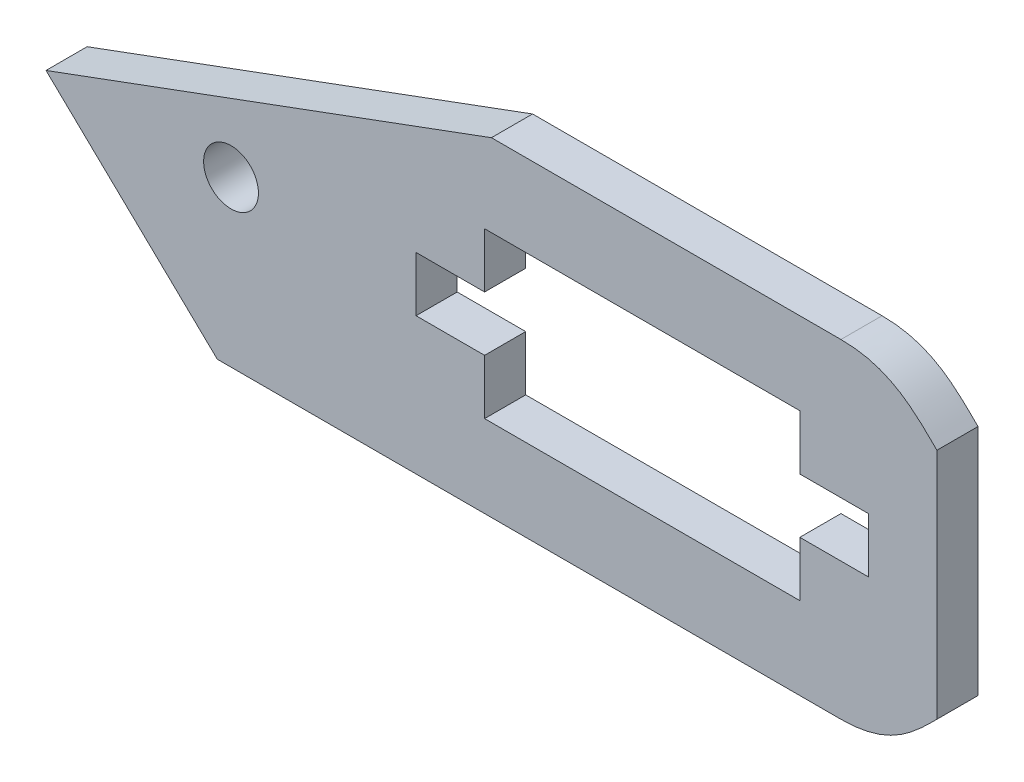
ISO-10303-21;
HEADER;
FILE_DESCRIPTION(('STEP AP214'),'2;1');
FILE_NAME('part.step','',(''),(''),'','','');
FILE_SCHEMA(('AUTOMOTIVE_DESIGN { 1 0 10303 214 1 1 1 1 }'));
ENDSEC;
DATA;
#1=APPLICATION_CONTEXT('core data for automotive mechanical design processes');
#2=APPLICATION_PROTOCOL_DEFINITION('international standard','automotive_design',2000,#1);
#3=PRODUCT_CONTEXT('',#1,'mechanical');
#4=PRODUCT('Part','Part','',(#3));
#5=PRODUCT_RELATED_PRODUCT_CATEGORY('part','',(#4));
#6=PRODUCT_DEFINITION_FORMATION('','',#4);
#7=PRODUCT_DEFINITION_CONTEXT('part definition',#1,'design');
#8=PRODUCT_DEFINITION('design','',#6,#7);
#9=PRODUCT_DEFINITION_SHAPE('','',#8);
#10=(LENGTH_UNIT() NAMED_UNIT(*) SI_UNIT(.MILLI.,.METRE.));
#11=(NAMED_UNIT(*) PLANE_ANGLE_UNIT() SI_UNIT($,.RADIAN.));
#12=(NAMED_UNIT(*) SI_UNIT($,.STERADIAN.) SOLID_ANGLE_UNIT());
#13=UNCERTAINTY_MEASURE_WITH_UNIT(LENGTH_MEASURE(1.E-05),#10,'distance_accuracy_value','');
#14=(GEOMETRIC_REPRESENTATION_CONTEXT(3) GLOBAL_UNCERTAINTY_ASSIGNED_CONTEXT((#13)) GLOBAL_UNIT_ASSIGNED_CONTEXT((#10,
#11,#12)) REPRESENTATION_CONTEXT('',''));
#15=CARTESIAN_POINT('',(0.,0.,0.));
#16=DIRECTION('',(0.,0.,1.));
#17=DIRECTION('',(1.,0.,0.));
#18=AXIS2_PLACEMENT_3D('',#15,#16,#17);
#19=CARTESIAN_POINT('',(0.,-12.,3.));
#20=DIRECTION('',(0.,-1.,0.));
#21=DIRECTION('',(1.,0.,0.));
#22=AXIS2_PLACEMENT_3D('',#19,#20,#21);
#23=PLANE('',#22);
#24=DIRECTION('',(-1.,0.,0.));
#25=VECTOR('',#24,1.);
#26=CARTESIAN_POINT('',(0.,-12.,0.));
#27=LINE('',#26,#25);
#28=CARTESIAN_POINT('',(23.5985424972736,-12.,0.));
#29=VERTEX_POINT('',#28);
#30=CARTESIAN_POINT('',(-21.9014575027261,-12.,0.));
#31=VERTEX_POINT('',#30);
#32=EDGE_CURVE('E235',#29,#31,#27,.T.);
#33=ORIENTED_EDGE('',*,*,#32,.F.);
#34=DIRECTION('',(0.,0.,-1.));
#35=VECTOR('',#34,1.);
#36=CARTESIAN_POINT('',(23.5985424972736,-12.,3.));
#37=LINE('',#36,#35);
#38=CARTESIAN_POINT('',(23.5985424972736,-12.,3.));
#39=VERTEX_POINT('',#38);
#40=EDGE_CURVE('E11',#39,#29,#37,.T.);
#41=ORIENTED_EDGE('',*,*,#40,.F.);
#42=DIRECTION('',(-1.,0.,0.));
#43=VECTOR('',#42,1.);
#44=CARTESIAN_POINT('',(0.,-12.,3.));
#45=LINE('',#44,#43);
#46=CARTESIAN_POINT('',(-21.9014575027261,-12.,3.));
#47=VERTEX_POINT('',#46);
#48=EDGE_CURVE('E338',#39,#47,#45,.T.);
#49=ORIENTED_EDGE('',*,*,#48,.T.);
#50=DIRECTION('',(0.,0.,-1.));
#51=VECTOR('',#50,1.);
#52=CARTESIAN_POINT('',(-21.9014575027261,-12.,3.));
#53=LINE('',#52,#51);
#54=EDGE_CURVE('E121',#47,#31,#53,.T.);
#55=ORIENTED_EDGE('',*,*,#54,.T.);
#56=EDGE_LOOP('',(#33,#41,#49,#55));
#57=FACE_BOUND('',#56,.T.);
#58=ADVANCED_FACE('F35',(#57),#23,.T.);
#59=CARTESIAN_POINT('',(23.5985424972736,-12.,3.));
#60=CARTESIAN_POINT('',(30.5985424972736,-12.,3.));
#61=CARTESIAN_POINT('',(30.5985424972736,-5.,3.));
#62=CARTESIAN_POINT('',(37.5985424972736,-5.,3.));
#63=B_SPLINE_CURVE_WITH_KNOTS('',3,(#59,#60,#61,#62),.UNSPECIFIED.,.F.,.F.,(4,4),(0.,1.),.UNSPECIFIED.);
#64=DIRECTION('',(0.,0.,-1.));
#65=VECTOR('',#64,1.);
#66=SURFACE_OF_LINEAR_EXTRUSION('',#63,#65);
#67=CARTESIAN_POINT('',(23.5985424972736,-12.,0.));
#68=CARTESIAN_POINT('',(30.5985424972736,-12.,0.));
#69=CARTESIAN_POINT('',(30.5985424972736,-5.,0.));
#70=CARTESIAN_POINT('',(37.5985424972736,-5.,0.));
#71=B_SPLINE_CURVE_WITH_KNOTS('',3,(#67,#68,#69,#70),.UNSPECIFIED.,.F.,.F.,(4,4),(0.,1.),.UNSPECIFIED.);
#72=CARTESIAN_POINT('',(30.5985424972736,-8.5,0.));
#73=VERTEX_POINT('',#72);
#74=EDGE_CURVE('E238',#29,#73,#71,.T.);
#75=ORIENTED_EDGE('',*,*,#74,.T.);
#76=DIRECTION('',(0.,0.,-1.));
#77=VECTOR('',#76,1.);
#78=CARTESIAN_POINT('',(30.5985424972736,-8.5,3.));
#79=LINE('',#78,#77);
#80=CARTESIAN_POINT('',(30.5985424972736,-8.5,3.));
#81=VERTEX_POINT('',#80);
#82=EDGE_CURVE('E45',#81,#73,#79,.T.);
#83=ORIENTED_EDGE('',*,*,#82,.F.);
#84=EDGE_CURVE('E340',#39,#81,#63,.T.);
#85=ORIENTED_EDGE('',*,*,#84,.F.);
#86=ORIENTED_EDGE('',*,*,#40,.T.);
#87=EDGE_LOOP('',(#75,#83,#85,#86));
#88=FACE_BOUND('',#87,.T.);
#89=ADVANCED_FACE('F350',(#88),#66,.F.);
#90=CARTESIAN_POINT('',(30.5985424972736,0.,3.));
#91=DIRECTION('',(1.,0.,0.));
#92=DIRECTION('',(0.,1.,0.));
#93=AXIS2_PLACEMENT_3D('',#90,#91,#92);
#94=PLANE('',#93);
#95=DIRECTION('',(0.,-1.,0.));
#96=VECTOR('',#95,1.);
#97=CARTESIAN_POINT('',(30.5985424972736,0.,0.));
#98=LINE('',#97,#96);
#99=CARTESIAN_POINT('',(30.5985424972736,8.50000000000001,0.));
#100=VERTEX_POINT('',#99);
#101=EDGE_CURVE('E243',#100,#73,#98,.T.);
#102=ORIENTED_EDGE('',*,*,#101,.F.);
#103=DIRECTION('',(0.,0.,-1.));
#104=VECTOR('',#103,1.);
#105=CARTESIAN_POINT('',(30.5985424972736,8.50000000000001,3.));
#106=LINE('',#105,#104);
#107=CARTESIAN_POINT('',(30.5985424972736,8.50000000000001,3.));
#108=VERTEX_POINT('',#107);
#109=EDGE_CURVE('E266',#108,#100,#106,.T.);
#110=ORIENTED_EDGE('',*,*,#109,.F.);
#111=DIRECTION('',(0.,-1.,0.));
#112=VECTOR('',#111,1.);
#113=CARTESIAN_POINT('',(30.5985424972736,0.,3.));
#114=LINE('',#113,#112);
#115=EDGE_CURVE('E345',#108,#81,#114,.T.);
#116=ORIENTED_EDGE('',*,*,#115,.T.);
#117=ORIENTED_EDGE('',*,*,#82,.T.);
#118=EDGE_LOOP('',(#102,#110,#116,#117));
#119=FACE_BOUND('',#118,.T.);
#120=ADVANCED_FACE('F354',(#119),#94,.T.);
#121=CARTESIAN_POINT('',(23.5985424972736,12.,3.));
#122=CARTESIAN_POINT('',(30.5985424972736,12.,3.));
#123=CARTESIAN_POINT('',(30.5985424972736,5.,3.));
#124=CARTESIAN_POINT('',(37.5985424972736,5.,3.));
#125=B_SPLINE_CURVE_WITH_KNOTS('',3,(#121,#122,#123,#124),.UNSPECIFIED.,.F.,.F.,(4,4),(0.,1.),.UNSPECIFIED.);
#126=DIRECTION('',(0.,0.,-1.));
#127=VECTOR('',#126,1.);
#128=SURFACE_OF_LINEAR_EXTRUSION('',#125,#127);
#129=CARTESIAN_POINT('',(23.5985424972736,12.,0.));
#130=CARTESIAN_POINT('',(30.5985424972736,12.,0.));
#131=CARTESIAN_POINT('',(30.5985424972736,5.,0.));
#132=CARTESIAN_POINT('',(37.5985424972736,5.,0.));
#133=B_SPLINE_CURVE_WITH_KNOTS('',3,(#129,#130,#131,#132),.UNSPECIFIED.,.F.,.F.,(4,4),(0.,1.),.UNSPECIFIED.);
#134=CARTESIAN_POINT('',(23.5985424972736,12.,0.));
#135=VERTEX_POINT('',#134);
#136=EDGE_CURVE('E249',#135,#100,#133,.T.);
#137=ORIENTED_EDGE('',*,*,#136,.F.);
#138=DIRECTION('',(0.,0.,-1.));
#139=VECTOR('',#138,1.);
#140=CARTESIAN_POINT('',(23.5985424972736,12.,3.));
#141=LINE('',#140,#139);
#142=CARTESIAN_POINT('',(23.5985424972736,12.,3.));
#143=VERTEX_POINT('',#142);
#144=EDGE_CURVE('E195',#143,#135,#141,.T.);
#145=ORIENTED_EDGE('',*,*,#144,.F.);
#146=EDGE_CURVE('E184',#143,#108,#125,.T.);
#147=ORIENTED_EDGE('',*,*,#146,.T.);
#148=ORIENTED_EDGE('',*,*,#109,.T.);
#149=EDGE_LOOP('',(#137,#145,#147,#148));
#150=FACE_BOUND('',#149,.T.);
#151=ADVANCED_FACE('F401',(#150),#128,.T.);
#152=CARTESIAN_POINT('',(0.,12.,3.));
#153=DIRECTION('',(0.,-1.,0.));
#154=DIRECTION('',(1.,0.,0.));
#155=AXIS2_PLACEMENT_3D('',#152,#153,#154);
#156=PLANE('',#155);
#157=DIRECTION('',(-1.,0.,0.));
#158=VECTOR('',#157,1.);
#159=CARTESIAN_POINT('',(0.,12.,0.));
#160=LINE('',#159,#158);
#161=CARTESIAN_POINT('',(-1.90145750272643,12.,0.));
#162=VERTEX_POINT('',#161);
#163=EDGE_CURVE('E191',#135,#162,#160,.T.);
#164=ORIENTED_EDGE('',*,*,#163,.T.);
#165=DIRECTION('',(0.,0.,-1.));
#166=VECTOR('',#165,1.);
#167=CARTESIAN_POINT('',(-1.90145750272643,12.,3.));
#168=LINE('',#167,#166);
#169=CARTESIAN_POINT('',(-1.90145750272643,12.,3.));
#170=VERTEX_POINT('',#169);
#171=EDGE_CURVE('E188',#170,#162,#168,.T.);
#172=ORIENTED_EDGE('',*,*,#171,.F.);
#173=DIRECTION('',(-1.,0.,0.));
#174=VECTOR('',#173,1.);
#175=CARTESIAN_POINT('',(0.,12.,3.));
#176=LINE('',#175,#174);
#177=EDGE_CURVE('E177',#143,#170,#176,.T.);
#178=ORIENTED_EDGE('',*,*,#177,.F.);
#179=ORIENTED_EDGE('',*,*,#144,.T.);
#180=EDGE_LOOP('',(#164,#172,#178,#179));
#181=FACE_BOUND('',#180,.T.);
#182=ADVANCED_FACE('F189',(#181),#156,.F.);
#183=CARTESIAN_POINT('',(-4.12731504302654,11.1781449081969,3.));
#184=DIRECTION('',(-0.346374082759159,0.938096474139388,0.));
#185=DIRECTION('',(-0.938096474139388,-0.346374082759159,0.));
#186=AXIS2_PLACEMENT_3D('',#183,#184,#185);
#187=PLANE('',#186);
#188=DIRECTION('',(0.938096474139388,0.346374082759159,0.));
#189=VECTOR('',#188,1.);
#190=CARTESIAN_POINT('',(-4.12731504302654,11.1781449081969,0.));
#191=LINE('',#190,#189);
#192=CARTESIAN_POINT('',(-34.4014575027264,0.,0.));
#193=VERTEX_POINT('',#192);
#194=EDGE_CURVE('E258',#193,#162,#191,.T.);
#195=ORIENTED_EDGE('',*,*,#194,.F.);
#196=DIRECTION('',(0.,0.,-1.));
#197=VECTOR('',#196,1.);
#198=CARTESIAN_POINT('',(-34.4014575027264,0.,3.));
#199=LINE('',#198,#197);
#200=CARTESIAN_POINT('',(-34.4014575027264,0.,3.));
#201=VERTEX_POINT('',#200);
#202=EDGE_CURVE('E114',#201,#193,#199,.T.);
#203=ORIENTED_EDGE('',*,*,#202,.F.);
#204=DIRECTION('',(0.938096474139388,0.346374082759159,0.));
#205=VECTOR('',#204,1.);
#206=CARTESIAN_POINT('',(-4.12731504302654,11.1781449081969,3.));
#207=LINE('',#206,#205);
#208=EDGE_CURVE('E181',#201,#170,#207,.T.);
#209=ORIENTED_EDGE('',*,*,#208,.T.);
#210=ORIENTED_EDGE('',*,*,#171,.T.);
#211=EDGE_LOOP('',(#195,#203,#209,#210));
#212=FACE_BOUND('',#211,.T.);
#213=ADVANCED_FACE('F197',(#212),#187,.T.);
#214=CARTESIAN_POINT('',(0.,2.,3.));
#215=DIRECTION('',(0.,1.,0.));
#216=DIRECTION('',(0.,0.,1.));
#217=AXIS2_PLACEMENT_3D('',#214,#215,#216);
#218=PLANE('',#217);
#219=DIRECTION('',(1.,0.,0.));
#220=VECTOR('',#219,1.);
#221=CARTESIAN_POINT('',(0.,2.,0.));
#222=LINE('',#221,#220);
#223=CARTESIAN_POINT('',(20.5985424972736,2.,0.));
#224=VERTEX_POINT('',#223);
#225=CARTESIAN_POINT('',(25.5985424972736,2.,0.));
#226=VERTEX_POINT('',#225);
#227=EDGE_CURVE('E203',#224,#226,#222,.T.);
#228=ORIENTED_EDGE('',*,*,#227,.T.);
#229=DIRECTION('',(0.,0.,-1.));
#230=VECTOR('',#229,1.);
#231=CARTESIAN_POINT('',(25.5985424972736,2.,3.));
#232=LINE('',#231,#230);
#233=CARTESIAN_POINT('',(25.5985424972736,2.,3.));
#234=VERTEX_POINT('',#233);
#235=EDGE_CURVE('E39',#234,#226,#232,.T.);
#236=ORIENTED_EDGE('',*,*,#235,.F.);
#237=DIRECTION('',(1.,0.,0.));
#238=VECTOR('',#237,1.);
#239=CARTESIAN_POINT('',(0.,2.,3.));
#240=LINE('',#239,#238);
#241=CARTESIAN_POINT('',(20.5985424972736,2.,3.));
#242=VERTEX_POINT('',#241);
#243=EDGE_CURVE('E262',#242,#234,#240,.T.);
#244=ORIENTED_EDGE('',*,*,#243,.F.);
#245=DIRECTION('',(0.,0.,-1.));
#246=VECTOR('',#245,1.);
#247=CARTESIAN_POINT('',(20.5985424972736,2.,3.));
#248=LINE('',#247,#246);
#249=EDGE_CURVE('E199',#242,#224,#248,.T.);
#250=ORIENTED_EDGE('',*,*,#249,.T.);
#251=EDGE_LOOP('',(#228,#236,#244,#250));
#252=FACE_BOUND('',#251,.T.);
#253=ADVANCED_FACE('F37',(#252),#218,.F.);
#254=CARTESIAN_POINT('',(25.5985424972736,0.,3.));
#255=DIRECTION('',(1.,0.,0.));
#256=DIRECTION('',(0.,1.,0.));
#257=AXIS2_PLACEMENT_3D('',#254,#255,#256);
#258=PLANE('',#257);
#259=DIRECTION('',(0.,-1.,0.));
#260=VECTOR('',#259,1.);
#261=CARTESIAN_POINT('',(25.5985424972736,0.,0.));
#262=LINE('',#261,#260);
#263=CARTESIAN_POINT('',(25.5985424972736,-2.,0.));
#264=VERTEX_POINT('',#263);
#265=EDGE_CURVE('E206',#226,#264,#262,.T.);
#266=ORIENTED_EDGE('',*,*,#265,.T.);
#267=DIRECTION('',(0.,0.,-1.));
#268=VECTOR('',#267,1.);
#269=CARTESIAN_POINT('',(25.5985424972736,-2.,3.));
#270=LINE('',#269,#268);
#271=CARTESIAN_POINT('',(25.5985424972736,-2.,3.));
#272=VERTEX_POINT('',#271);
#273=EDGE_CURVE('E289',#272,#264,#270,.T.);
#274=ORIENTED_EDGE('',*,*,#273,.F.);
#275=DIRECTION('',(0.,-1.,0.));
#276=VECTOR('',#275,1.);
#277=CARTESIAN_POINT('',(25.5985424972736,0.,3.));
#278=LINE('',#277,#276);
#279=EDGE_CURVE('E129',#234,#272,#278,.T.);
#280=ORIENTED_EDGE('',*,*,#279,.F.);
#281=ORIENTED_EDGE('',*,*,#235,.T.);
#282=EDGE_LOOP('',(#266,#274,#280,#281));
#283=FACE_BOUND('',#282,.T.);
#284=ADVANCED_FACE('F294',(#283),#258,.F.);
#285=CARTESIAN_POINT('',(0.,-2.,3.));
#286=DIRECTION('',(0.,1.,0.));
#287=DIRECTION('',(0.,0.,1.));
#288=AXIS2_PLACEMENT_3D('',#285,#286,#287);
#289=PLANE('',#288);
#290=DIRECTION('',(1.,0.,0.));
#291=VECTOR('',#290,1.);
#292=CARTESIAN_POINT('',(0.,-2.,0.));
#293=LINE('',#292,#291);
#294=CARTESIAN_POINT('',(20.5985424972736,-2.,0.));
#295=VERTEX_POINT('',#294);
#296=EDGE_CURVE('E210',#295,#264,#293,.T.);
#297=ORIENTED_EDGE('',*,*,#296,.F.);
#298=DIRECTION('',(0.,0.,-1.));
#299=VECTOR('',#298,1.);
#300=CARTESIAN_POINT('',(20.5985424972736,-2.,3.));
#301=LINE('',#300,#299);
#302=CARTESIAN_POINT('',(20.5985424972736,-2.,3.));
#303=VERTEX_POINT('',#302);
#304=EDGE_CURVE('E288',#303,#295,#301,.T.);
#305=ORIENTED_EDGE('',*,*,#304,.F.);
#306=DIRECTION('',(1.,0.,0.));
#307=VECTOR('',#306,1.);
#308=CARTESIAN_POINT('',(0.,-2.,3.));
#309=LINE('',#308,#307);
#310=EDGE_CURVE('E308',#303,#272,#309,.T.);
#311=ORIENTED_EDGE('',*,*,#310,.T.);
#312=ORIENTED_EDGE('',*,*,#273,.T.);
#313=EDGE_LOOP('',(#297,#305,#311,#312));
#314=FACE_BOUND('',#313,.T.);
#315=ADVANCED_FACE('F305',(#314),#289,.T.);
#316=CARTESIAN_POINT('',(20.5985424972736,0.,3.));
#317=DIRECTION('',(1.,0.,0.));
#318=DIRECTION('',(0.,0.,-1.));
#319=AXIS2_PLACEMENT_3D('',#316,#317,#318);
#320=PLANE('',#319);
#321=DIRECTION('',(0.,-1.,0.));
#322=VECTOR('',#321,1.);
#323=CARTESIAN_POINT('',(20.5985424972736,0.,0.));
#324=LINE('',#323,#322);
#325=CARTESIAN_POINT('',(20.5985424972736,-6.,0.));
#326=VERTEX_POINT('',#325);
#327=EDGE_CURVE('E213',#295,#326,#324,.T.);
#328=ORIENTED_EDGE('',*,*,#327,.T.);
#329=DIRECTION('',(0.,0.,-1.));
#330=VECTOR('',#329,1.);
#331=CARTESIAN_POINT('',(20.5985424972736,-6.,3.));
#332=LINE('',#331,#330);
#333=CARTESIAN_POINT('',(20.5985424972736,-6.,3.));
#334=VERTEX_POINT('',#333);
#335=EDGE_CURVE('E286',#334,#326,#332,.T.);
#336=ORIENTED_EDGE('',*,*,#335,.F.);
#337=DIRECTION('',(0.,-1.,0.));
#338=VECTOR('',#337,1.);
#339=CARTESIAN_POINT('',(20.5985424972736,0.,3.));
#340=LINE('',#339,#338);
#341=EDGE_CURVE('E311',#303,#334,#340,.T.);
#342=ORIENTED_EDGE('',*,*,#341,.F.);
#343=ORIENTED_EDGE('',*,*,#304,.T.);
#344=EDGE_LOOP('',(#328,#336,#342,#343));
#345=FACE_BOUND('',#344,.T.);
#346=ADVANCED_FACE('F312',(#345),#320,.F.);
#347=CARTESIAN_POINT('',(0.,-6.,3.));
#348=DIRECTION('',(0.,1.,0.));
#349=DIRECTION('',(0.,0.,1.));
#350=AXIS2_PLACEMENT_3D('',#347,#348,#349);
#351=PLANE('',#350);
#352=DIRECTION('',(1.,0.,0.));
#353=VECTOR('',#352,1.);
#354=CARTESIAN_POINT('',(0.,-6.,0.));
#355=LINE('',#354,#353);
#356=CARTESIAN_POINT('',(-2.40145750272644,-6.,0.));
#357=VERTEX_POINT('',#356);
#358=EDGE_CURVE('E216',#357,#326,#355,.T.);
#359=ORIENTED_EDGE('',*,*,#358,.F.);
#360=DIRECTION('',(0.,0.,-1.));
#361=VECTOR('',#360,1.);
#362=CARTESIAN_POINT('',(-2.40145750272644,-6.,3.));
#363=LINE('',#362,#361);
#364=CARTESIAN_POINT('',(-2.40145750272644,-6.,3.));
#365=VERTEX_POINT('',#364);
#366=EDGE_CURVE('E284',#365,#357,#363,.T.);
#367=ORIENTED_EDGE('',*,*,#366,.F.);
#368=DIRECTION('',(1.,0.,0.));
#369=VECTOR('',#368,1.);
#370=CARTESIAN_POINT('',(0.,-6.,3.));
#371=LINE('',#370,#369);
#372=EDGE_CURVE('E316',#365,#334,#371,.T.);
#373=ORIENTED_EDGE('',*,*,#372,.T.);
#374=ORIENTED_EDGE('',*,*,#335,.T.);
#375=EDGE_LOOP('',(#359,#367,#373,#374));
#376=FACE_BOUND('',#375,.T.);
#377=ADVANCED_FACE('F385',(#376),#351,.T.);
#378=CARTESIAN_POINT('',(-2.40145750272644,0.,3.));
#379=DIRECTION('',(1.,0.,0.));
#380=DIRECTION('',(0.,1.,0.));
#381=AXIS2_PLACEMENT_3D('',#378,#379,#380);
#382=PLANE('',#381);
#383=DIRECTION('',(0.,-1.,0.));
#384=VECTOR('',#383,1.);
#385=CARTESIAN_POINT('',(-2.40145750272644,0.,0.));
#386=LINE('',#385,#384);
#387=CARTESIAN_POINT('',(-2.40145750272644,-2.,0.));
#388=VERTEX_POINT('',#387);
#389=EDGE_CURVE('E220',#388,#357,#386,.T.);
#390=ORIENTED_EDGE('',*,*,#389,.F.);
#391=DIRECTION('',(0.,0.,-1.));
#392=VECTOR('',#391,1.);
#393=CARTESIAN_POINT('',(-2.40145750272644,-2.,3.));
#394=LINE('',#393,#392);
#395=CARTESIAN_POINT('',(-2.40145750272644,-2.,3.));
#396=VERTEX_POINT('',#395);
#397=EDGE_CURVE('E282',#396,#388,#394,.T.);
#398=ORIENTED_EDGE('',*,*,#397,.F.);
#399=DIRECTION('',(0.,-1.,0.));
#400=VECTOR('',#399,1.);
#401=CARTESIAN_POINT('',(-2.40145750272644,0.,3.));
#402=LINE('',#401,#400);
#403=EDGE_CURVE('E324',#396,#365,#402,.T.);
#404=ORIENTED_EDGE('',*,*,#403,.T.);
#405=ORIENTED_EDGE('',*,*,#366,.T.);
#406=EDGE_LOOP('',(#390,#398,#404,#405));
#407=FACE_BOUND('',#406,.T.);
#408=ADVANCED_FACE('F373',(#407),#382,.T.);
#409=CARTESIAN_POINT('',(0.,-2.,3.));
#410=DIRECTION('',(0.,-1.,0.));
#411=DIRECTION('',(1.,0.,0.));
#412=AXIS2_PLACEMENT_3D('',#409,#410,#411);
#413=PLANE('',#412);
#414=DIRECTION('',(-1.,0.,0.));
#415=VECTOR('',#414,1.);
#416=CARTESIAN_POINT('',(0.,-2.,0.));
#417=LINE('',#416,#415);
#418=CARTESIAN_POINT('',(-7.40145750272644,-2.,0.));
#419=VERTEX_POINT('',#418);
#420=EDGE_CURVE('E223',#388,#419,#417,.T.);
#421=ORIENTED_EDGE('',*,*,#420,.T.);
#422=DIRECTION('',(0.,0.,-1.));
#423=VECTOR('',#422,1.);
#424=CARTESIAN_POINT('',(-7.40145750272644,-2.,3.));
#425=LINE('',#424,#423);
#426=CARTESIAN_POINT('',(-7.40145750272644,-2.,3.));
#427=VERTEX_POINT('',#426);
#428=EDGE_CURVE('E280',#427,#419,#425,.T.);
#429=ORIENTED_EDGE('',*,*,#428,.F.);
#430=DIRECTION('',(-1.,0.,0.));
#431=VECTOR('',#430,1.);
#432=CARTESIAN_POINT('',(0.,-2.,3.));
#433=LINE('',#432,#431);
#434=EDGE_CURVE('E327',#396,#427,#433,.T.);
#435=ORIENTED_EDGE('',*,*,#434,.F.);
#436=ORIENTED_EDGE('',*,*,#397,.T.);
#437=EDGE_LOOP('',(#421,#429,#435,#436));
#438=FACE_BOUND('',#437,.T.);
#439=ADVANCED_FACE('F380',(#438),#413,.F.);
#440=CARTESIAN_POINT('',(-7.40145750272644,0.,3.));
#441=DIRECTION('',(1.,0.,0.));
#442=DIRECTION('',(0.,1.,0.));
#443=AXIS2_PLACEMENT_3D('',#440,#441,#442);
#444=PLANE('',#443);
#445=DIRECTION('',(0.,-1.,0.));
#446=VECTOR('',#445,1.);
#447=CARTESIAN_POINT('',(-7.40145750272644,0.,0.));
#448=LINE('',#447,#446);
#449=CARTESIAN_POINT('',(-7.40145750272644,2.,0.));
#450=VERTEX_POINT('',#449);
#451=EDGE_CURVE('E227',#450,#419,#448,.T.);
#452=ORIENTED_EDGE('',*,*,#451,.F.);
#453=DIRECTION('',(0.,0.,-1.));
#454=VECTOR('',#453,1.);
#455=CARTESIAN_POINT('',(-7.40145750272644,2.,3.));
#456=LINE('',#455,#454);
#457=CARTESIAN_POINT('',(-7.40145750272644,2.,3.));
#458=VERTEX_POINT('',#457);
#459=EDGE_CURVE('E278',#458,#450,#456,.T.);
#460=ORIENTED_EDGE('',*,*,#459,.F.);
#461=DIRECTION('',(0.,-1.,0.));
#462=VECTOR('',#461,1.);
#463=CARTESIAN_POINT('',(-7.40145750272644,0.,3.));
#464=LINE('',#463,#462);
#465=EDGE_CURVE('E330',#458,#427,#464,.T.);
#466=ORIENTED_EDGE('',*,*,#465,.T.);
#467=ORIENTED_EDGE('',*,*,#428,.T.);
#468=EDGE_LOOP('',(#452,#460,#466,#467));
#469=FACE_BOUND('',#468,.T.);
#470=ADVANCED_FACE('F376',(#469),#444,.T.);
#471=CARTESIAN_POINT('',(0.,2.,3.));
#472=DIRECTION('',(0.,-1.,0.));
#473=DIRECTION('',(1.,0.,0.));
#474=AXIS2_PLACEMENT_3D('',#471,#472,#473);
#475=PLANE('',#474);
#476=DIRECTION('',(-1.,0.,0.));
#477=VECTOR('',#476,1.);
#478=CARTESIAN_POINT('',(0.,2.,0.));
#479=LINE('',#478,#477);
#480=CARTESIAN_POINT('',(-2.40145750272644,2.,0.));
#481=VERTEX_POINT('',#480);
#482=EDGE_CURVE('E230',#481,#450,#479,.T.);
#483=ORIENTED_EDGE('',*,*,#482,.F.);
#484=DIRECTION('',(0.,0.,-1.));
#485=VECTOR('',#484,1.);
#486=CARTESIAN_POINT('',(-2.40145750272644,2.,3.));
#487=LINE('',#486,#485);
#488=CARTESIAN_POINT('',(-2.40145750272644,2.,3.));
#489=VERTEX_POINT('',#488);
#490=EDGE_CURVE('E276',#489,#481,#487,.T.);
#491=ORIENTED_EDGE('',*,*,#490,.F.);
#492=DIRECTION('',(-1.,0.,0.));
#493=VECTOR('',#492,1.);
#494=CARTESIAN_POINT('',(0.,2.,3.));
#495=LINE('',#494,#493);
#496=EDGE_CURVE('E333',#489,#458,#495,.T.);
#497=ORIENTED_EDGE('',*,*,#496,.T.);
#498=ORIENTED_EDGE('',*,*,#459,.T.);
#499=EDGE_LOOP('',(#483,#491,#497,#498));
#500=FACE_BOUND('',#499,.T.);
#501=ADVANCED_FACE('F371',(#500),#475,.T.);
#502=CARTESIAN_POINT('',(-2.40145750272644,6.,0.));
#503=VERTEX_POINT('',#502);
#504=EDGE_CURVE('E224',#503,#481,#386,.T.);
#505=ORIENTED_EDGE('',*,*,#504,.F.);
#506=DIRECTION('',(0.,0.,-1.));
#507=VECTOR('',#506,1.);
#508=CARTESIAN_POINT('',(-2.40145750272644,6.,3.));
#509=LINE('',#508,#507);
#510=CARTESIAN_POINT('',(-2.40145750272644,6.,3.));
#511=VERTEX_POINT('',#510);
#512=EDGE_CURVE('E274',#511,#503,#509,.T.);
#513=ORIENTED_EDGE('',*,*,#512,.F.);
#514=EDGE_CURVE('E328',#511,#489,#402,.T.);
#515=ORIENTED_EDGE('',*,*,#514,.T.);
#516=ORIENTED_EDGE('',*,*,#490,.T.);
#517=EDGE_LOOP('',(#505,#513,#515,#516));
#518=FACE_BOUND('',#517,.T.);
#519=ADVANCED_FACE('F367',(#518),#382,.T.);
#520=CARTESIAN_POINT('',(0.,6.,3.));
#521=DIRECTION('',(0.,1.,0.));
#522=DIRECTION('',(-1.,0.,0.));
#523=AXIS2_PLACEMENT_3D('',#520,#521,#522);
#524=PLANE('',#523);
#525=DIRECTION('',(1.,0.,0.));
#526=VECTOR('',#525,1.);
#527=CARTESIAN_POINT('',(0.,6.,0.));
#528=LINE('',#527,#526);
#529=CARTESIAN_POINT('',(20.5985424972736,6.,0.));
#530=VERTEX_POINT('',#529);
#531=EDGE_CURVE('E233',#503,#530,#528,.T.);
#532=ORIENTED_EDGE('',*,*,#531,.T.);
#533=DIRECTION('',(0.,0.,-1.));
#534=VECTOR('',#533,1.);
#535=CARTESIAN_POINT('',(20.5985424972736,6.,3.));
#536=LINE('',#535,#534);
#537=CARTESIAN_POINT('',(20.5985424972736,6.,3.));
#538=VERTEX_POINT('',#537);
#539=EDGE_CURVE('E271',#538,#530,#536,.T.);
#540=ORIENTED_EDGE('',*,*,#539,.F.);
#541=DIRECTION('',(1.,0.,0.));
#542=VECTOR('',#541,1.);
#543=CARTESIAN_POINT('',(0.,6.,3.));
#544=LINE('',#543,#542);
#545=EDGE_CURVE('E336',#511,#538,#544,.T.);
#546=ORIENTED_EDGE('',*,*,#545,.F.);
#547=ORIENTED_EDGE('',*,*,#512,.T.);
#548=EDGE_LOOP('',(#532,#540,#546,#547));
#549=FACE_BOUND('',#548,.T.);
#550=ADVANCED_FACE('F363',(#549),#524,.F.);
#551=EDGE_CURVE('E217',#530,#224,#324,.T.);
#552=ORIENTED_EDGE('',*,*,#551,.T.);
#553=ORIENTED_EDGE('',*,*,#249,.F.);
#554=EDGE_CURVE('E318',#538,#242,#340,.T.);
#555=ORIENTED_EDGE('',*,*,#554,.F.);
#556=ORIENTED_EDGE('',*,*,#539,.T.);
#557=EDGE_LOOP('',(#552,#553,#555,#556));
#558=FACE_BOUND('',#557,.T.);
#559=ADVANCED_FACE('F359',(#558),#320,.F.);
#560=CARTESIAN_POINT('',(-16.4989504759117,-17.1864067457418,3.));
#561=DIRECTION('',(0.692531828189704,0.72138732103096,0.));
#562=DIRECTION('',(-0.72138732103096,0.692531828189704,0.));
#563=AXIS2_PLACEMENT_3D('',#560,#561,#562);
#564=PLANE('',#563);
#565=DIRECTION('',(0.72138732103096,-0.692531828189704,0.));
#566=VECTOR('',#565,1.);
#567=CARTESIAN_POINT('',(-16.4989504759117,-17.1864067457418,0.));
#568=LINE('',#567,#566);
#569=EDGE_CURVE('E260',#193,#31,#568,.T.);
#570=ORIENTED_EDGE('',*,*,#569,.T.);
#571=ORIENTED_EDGE('',*,*,#54,.F.);
#572=DIRECTION('',(0.72138732103096,-0.692531828189704,0.));
#573=VECTOR('',#572,1.);
#574=CARTESIAN_POINT('',(-16.4989504759117,-17.1864067457418,3.));
#575=LINE('',#574,#573);
#576=EDGE_CURVE('E54',#201,#47,#575,.T.);
#577=ORIENTED_EDGE('',*,*,#576,.F.);
#578=ORIENTED_EDGE('',*,*,#202,.T.);
#579=EDGE_LOOP('',(#570,#571,#577,#578));
#580=FACE_BOUND('',#579,.T.);
#581=ADVANCED_FACE('F362',(#580),#564,.F.);
#582=CARTESIAN_POINT('',(0.,0.,3.));
#583=DIRECTION('',(0.,0.,1.));
#584=DIRECTION('',(1.,0.,0.));
#585=AXIS2_PLACEMENT_3D('',#582,#583,#584);
#586=PLANE('',#585);
#587=CARTESIAN_POINT('',(-20.9014575027264,0.,3.));
#588=DIRECTION('',(0.,0.,1.));
#589=DIRECTION('',(1.,0.,0.));
#590=AXIS2_PLACEMENT_3D('',#587,#588,#589);
#591=CIRCLE('',#590,2.);
#592=CARTESIAN_POINT('',(-18.9014575027264,0.,3.));
#593=VERTEX_POINT('',#592);
#594=EDGE_CURVE('E442',#593,#593,#591,.T.);
#595=ORIENTED_EDGE('',*,*,#594,.F.);
#596=EDGE_LOOP('',(#595));
#597=FACE_BOUND('',#596,.T.);
#598=ORIENTED_EDGE('',*,*,#243,.T.);
#599=ORIENTED_EDGE('',*,*,#279,.T.);
#600=ORIENTED_EDGE('',*,*,#310,.F.);
#601=ORIENTED_EDGE('',*,*,#341,.T.);
#602=ORIENTED_EDGE('',*,*,#372,.F.);
#603=ORIENTED_EDGE('',*,*,#403,.F.);
#604=ORIENTED_EDGE('',*,*,#434,.T.);
#605=ORIENTED_EDGE('',*,*,#465,.F.);
#606=ORIENTED_EDGE('',*,*,#496,.F.);
#607=ORIENTED_EDGE('',*,*,#514,.F.);
#608=ORIENTED_EDGE('',*,*,#545,.T.);
#609=ORIENTED_EDGE('',*,*,#554,.T.);
#610=EDGE_LOOP('',(#598,#599,#600,#601,#602,#603,#604,#605,#606,#607,#608,#609));
#611=FACE_BOUND('',#610,.T.);
#612=ORIENTED_EDGE('',*,*,#48,.F.);
#613=ORIENTED_EDGE('',*,*,#84,.T.);
#614=ORIENTED_EDGE('',*,*,#115,.F.);
#615=ORIENTED_EDGE('',*,*,#146,.F.);
#616=ORIENTED_EDGE('',*,*,#177,.T.);
#617=ORIENTED_EDGE('',*,*,#208,.F.);
#618=ORIENTED_EDGE('',*,*,#576,.T.);
#619=EDGE_LOOP('',(#612,#613,#614,#615,#616,#617,#618));
#620=FACE_BOUND('',#619,.T.);
#621=ADVANCED_FACE('F179',(#597,#611,#620),#586,.T.);
#622=CARTESIAN_POINT('',(0.,0.,0.));
#623=DIRECTION('',(0.,0.,1.));
#624=DIRECTION('',(1.,0.,0.));
#625=AXIS2_PLACEMENT_3D('',#622,#623,#624);
#626=PLANE('',#625);
#627=CARTESIAN_POINT('',(-20.9014575027264,0.,0.));
#628=DIRECTION('',(0.,0.,1.));
#629=DIRECTION('',(1.,0.,0.));
#630=AXIS2_PLACEMENT_3D('',#627,#628,#629);
#631=CIRCLE('',#630,2.);
#632=CARTESIAN_POINT('',(-18.9014575027264,0.,0.));
#633=VERTEX_POINT('',#632);
#634=EDGE_CURVE('E207',#633,#633,#631,.T.);
#635=ORIENTED_EDGE('',*,*,#634,.T.);
#636=EDGE_LOOP('',(#635));
#637=FACE_BOUND('',#636,.T.);
#638=ORIENTED_EDGE('',*,*,#227,.F.);
#639=ORIENTED_EDGE('',*,*,#551,.F.);
#640=ORIENTED_EDGE('',*,*,#531,.F.);
#641=ORIENTED_EDGE('',*,*,#504,.T.);
#642=ORIENTED_EDGE('',*,*,#482,.T.);
#643=ORIENTED_EDGE('',*,*,#451,.T.);
#644=ORIENTED_EDGE('',*,*,#420,.F.);
#645=ORIENTED_EDGE('',*,*,#389,.T.);
#646=ORIENTED_EDGE('',*,*,#358,.T.);
#647=ORIENTED_EDGE('',*,*,#327,.F.);
#648=ORIENTED_EDGE('',*,*,#296,.T.);
#649=ORIENTED_EDGE('',*,*,#265,.F.);
#650=EDGE_LOOP('',(#638,#639,#640,#641,#642,#643,#644,#645,#646,#647,#648,#649));
#651=FACE_BOUND('',#650,.T.);
#652=ORIENTED_EDGE('',*,*,#32,.T.);
#653=ORIENTED_EDGE('',*,*,#569,.F.);
#654=ORIENTED_EDGE('',*,*,#194,.T.);
#655=ORIENTED_EDGE('',*,*,#163,.F.);
#656=ORIENTED_EDGE('',*,*,#136,.T.);
#657=ORIENTED_EDGE('',*,*,#101,.T.);
#658=ORIENTED_EDGE('',*,*,#74,.F.);
#659=EDGE_LOOP('',(#652,#653,#654,#655,#656,#657,#658));
#660=FACE_BOUND('',#659,.T.);
#661=ADVANCED_FACE('F301',(#637,#651,#660),#626,.F.);
#662=CARTESIAN_POINT('',(-20.9014575027264,0.,0.));
#663=DIRECTION('',(0.,0.,1.));
#664=DIRECTION('',(1.,0.,0.));
#665=AXIS2_PLACEMENT_3D('',#662,#663,#664);
#666=CYLINDRICAL_SURFACE('',#665,2.);
#667=ORIENTED_EDGE('',*,*,#634,.F.);
#668=EDGE_LOOP('',(#667));
#669=FACE_BOUND('',#668,.T.);
#670=ORIENTED_EDGE('',*,*,#594,.T.);
#671=EDGE_LOOP('',(#670));
#672=FACE_BOUND('',#671,.T.);
#673=ADVANCED_FACE('F429',(#669,#672),#666,.F.);
#674=CLOSED_SHELL('',(#58,#89,#120,#151,#182,#213,#253,#284,#315,#346,#377,#408,#439,#470,#501,
#519,#550,#559,#581,#621,#661,#673));
#675=MANIFOLD_SOLID_BREP('B2',#674);
#676=ADVANCED_BREP_SHAPE_REPRESENTATION('',(#18,#675),#14);
#677=SHAPE_DEFINITION_REPRESENTATION(#9,#676);
ENDSEC;
END-ISO-10303-21;
